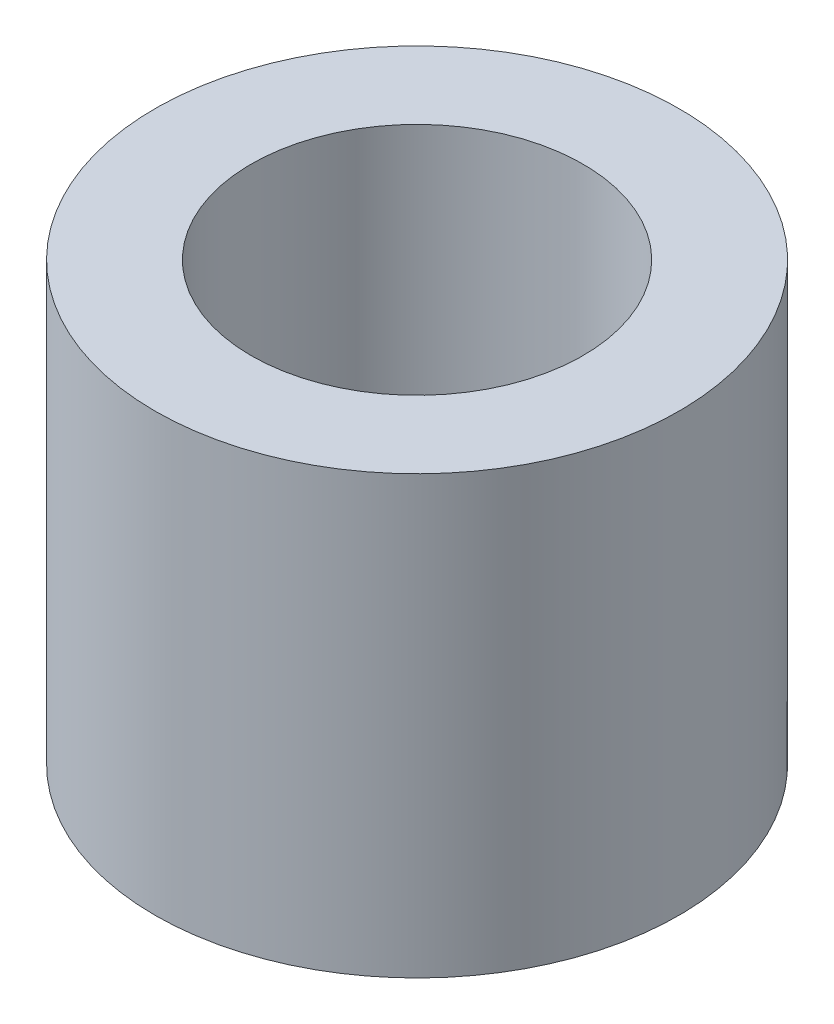
ISO-10303-21;
HEADER;
FILE_DESCRIPTION(('STEP AP214'),'2;1');
FILE_NAME('part.step','',(''),(''),'','','');
FILE_SCHEMA(('AUTOMOTIVE_DESIGN { 1 0 10303 214 1 1 1 1 }'));
ENDSEC;
DATA;
#1=APPLICATION_CONTEXT('core data for automotive mechanical design processes');
#2=APPLICATION_PROTOCOL_DEFINITION('international standard','automotive_design',2000,#1);
#3=PRODUCT_CONTEXT('',#1,'mechanical');
#4=PRODUCT('Part','Part','',(#3));
#5=PRODUCT_RELATED_PRODUCT_CATEGORY('part','',(#4));
#6=PRODUCT_DEFINITION_FORMATION('','',#4);
#7=PRODUCT_DEFINITION_CONTEXT('part definition',#1,'design');
#8=PRODUCT_DEFINITION('design','',#6,#7);
#9=PRODUCT_DEFINITION_SHAPE('','',#8);
#10=(LENGTH_UNIT() NAMED_UNIT(*) SI_UNIT(.MILLI.,.METRE.));
#11=(NAMED_UNIT(*) PLANE_ANGLE_UNIT() SI_UNIT($,.RADIAN.));
#12=(NAMED_UNIT(*) SI_UNIT($,.STERADIAN.) SOLID_ANGLE_UNIT());
#13=UNCERTAINTY_MEASURE_WITH_UNIT(LENGTH_MEASURE(1.E-05),#10,'distance_accuracy_value','');
#14=(GEOMETRIC_REPRESENTATION_CONTEXT(3) GLOBAL_UNCERTAINTY_ASSIGNED_CONTEXT((#13)) GLOBAL_UNIT_ASSIGNED_CONTEXT((#10,
#11,#12)) REPRESENTATION_CONTEXT('',''));
#15=CARTESIAN_POINT('',(0.,0.,0.));
#16=DIRECTION('',(0.,0.,1.));
#17=DIRECTION('',(1.,0.,0.));
#18=AXIS2_PLACEMENT_3D('',#15,#16,#17);
#19=CARTESIAN_POINT('',(0.,5.,0.));
#20=DIRECTION('',(0.,1.,0.));
#21=DIRECTION('',(0.,0.,1.));
#22=AXIS2_PLACEMENT_3D('',#19,#20,#21);
#23=PLANE('',#22);
#24=CARTESIAN_POINT('',(0.,5.,0.));
#25=DIRECTION('',(0.,1.,0.));
#26=DIRECTION('',(0.,0.,1.));
#27=AXIS2_PLACEMENT_3D('',#24,#25,#26);
#28=CIRCLE('',#27,3.);
#29=CARTESIAN_POINT('',(0.,5.,3.));
#30=VERTEX_POINT('',#29);
#31=EDGE_CURVE('E10',#30,#30,#28,.T.);
#32=ORIENTED_EDGE('',*,*,#31,.T.);
#33=EDGE_LOOP('',(#32));
#34=FACE_BOUND('',#33,.T.);
#35=CARTESIAN_POINT('',(0.,5.,0.));
#36=DIRECTION('',(0.,1.,0.));
#37=DIRECTION('',(0.,0.,1.));
#38=AXIS2_PLACEMENT_3D('',#35,#36,#37);
#39=CIRCLE('',#38,1.9);
#40=CARTESIAN_POINT('',(0.,5.,1.9));
#41=VERTEX_POINT('',#40);
#42=EDGE_CURVE('E43',#41,#41,#39,.T.);
#43=ORIENTED_EDGE('',*,*,#42,.F.);
#44=EDGE_LOOP('',(#43));
#45=FACE_BOUND('',#44,.T.);
#46=ADVANCED_FACE('F32',(#34,#45),#23,.T.);
#47=CARTESIAN_POINT('',(0.,0.,0.));
#48=DIRECTION('',(0.,1.,0.));
#49=DIRECTION('',(0.,0.,1.));
#50=AXIS2_PLACEMENT_3D('',#47,#48,#49);
#51=PLANE('',#50);
#52=CARTESIAN_POINT('',(0.,0.,0.));
#53=DIRECTION('',(0.,1.,0.));
#54=DIRECTION('',(0.,0.,1.));
#55=AXIS2_PLACEMENT_3D('',#52,#53,#54);
#56=CIRCLE('',#55,3.);
#57=CARTESIAN_POINT('',(0.,0.,3.));
#58=VERTEX_POINT('',#57);
#59=EDGE_CURVE('E36',#58,#58,#56,.T.);
#60=ORIENTED_EDGE('',*,*,#59,.F.);
#61=EDGE_LOOP('',(#60));
#62=FACE_BOUND('',#61,.T.);
#63=CARTESIAN_POINT('',(0.,0.,0.));
#64=DIRECTION('',(0.,1.,0.));
#65=DIRECTION('',(0.,0.,1.));
#66=AXIS2_PLACEMENT_3D('',#63,#64,#65);
#67=CIRCLE('',#66,1.9);
#68=CARTESIAN_POINT('',(0.,0.,1.9));
#69=VERTEX_POINT('',#68);
#70=EDGE_CURVE('E45',#69,#69,#67,.T.);
#71=ORIENTED_EDGE('',*,*,#70,.T.);
#72=EDGE_LOOP('',(#71));
#73=FACE_BOUND('',#72,.T.);
#74=ADVANCED_FACE('F55',(#62,#73),#51,.F.);
#75=CARTESIAN_POINT('',(0.,5.,0.));
#76=DIRECTION('',(0.,-1.,0.));
#77=DIRECTION('',(0.,0.,-1.));
#78=AXIS2_PLACEMENT_3D('',#75,#76,#77);
#79=CYLINDRICAL_SURFACE('',#78,3.);
#80=ORIENTED_EDGE('',*,*,#31,.F.);
#81=EDGE_LOOP('',(#80));
#82=FACE_BOUND('',#81,.T.);
#83=ORIENTED_EDGE('',*,*,#59,.T.);
#84=EDGE_LOOP('',(#83));
#85=FACE_BOUND('',#84,.T.);
#86=ADVANCED_FACE('F34',(#82,#85),#79,.T.);
#87=CARTESIAN_POINT('',(0.,5.,0.));
#88=DIRECTION('',(0.,-1.,0.));
#89=DIRECTION('',(0.,0.,-1.));
#90=AXIS2_PLACEMENT_3D('',#87,#88,#89);
#91=CYLINDRICAL_SURFACE('',#90,1.9);
#92=ORIENTED_EDGE('',*,*,#42,.T.);
#93=EDGE_LOOP('',(#92));
#94=FACE_BOUND('',#93,.T.);
#95=ORIENTED_EDGE('',*,*,#70,.F.);
#96=EDGE_LOOP('',(#95));
#97=FACE_BOUND('',#96,.T.);
#98=ADVANCED_FACE('F51',(#94,#97),#91,.F.);
#99=CLOSED_SHELL('',(#46,#74,#86,#98));
#100=MANIFOLD_SOLID_BREP('B2',#99);
#101=ADVANCED_BREP_SHAPE_REPRESENTATION('',(#18,#100),#14);
#102=SHAPE_DEFINITION_REPRESENTATION(#9,#101);
ENDSEC;
END-ISO-10303-21;
